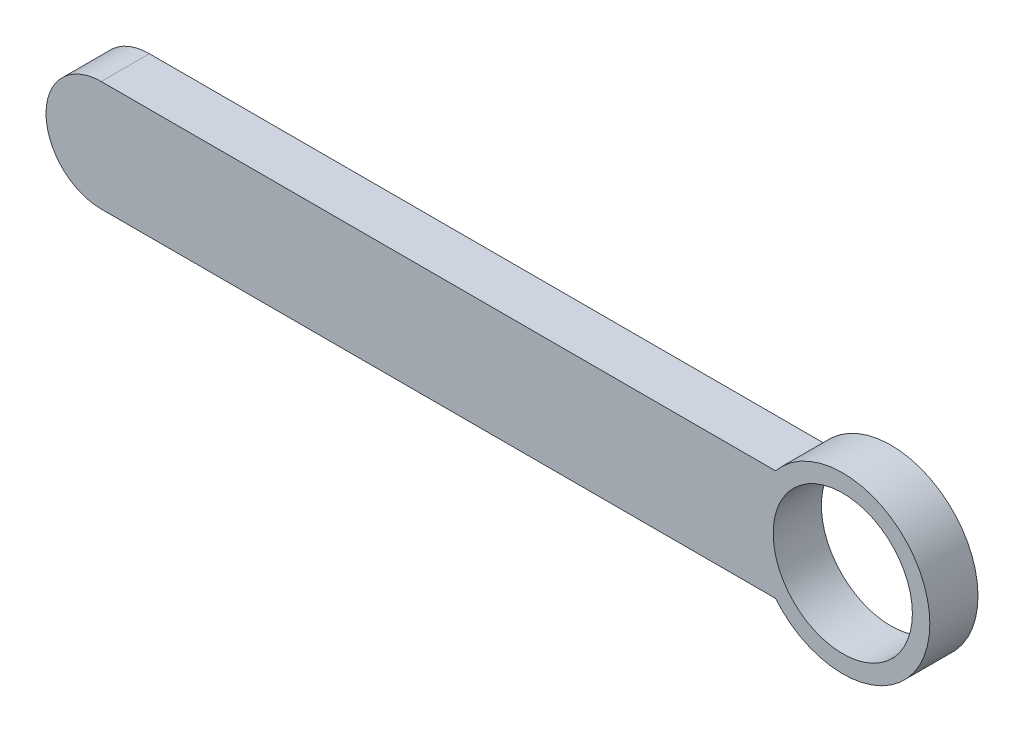
ISO-10303-21;
HEADER;
FILE_DESCRIPTION(('STEP AP214'),'2;1');
FILE_NAME('part.step','',(''),(''),'','','');
FILE_SCHEMA(('AUTOMOTIVE_DESIGN { 1 0 10303 214 1 1 1 1 }'));
ENDSEC;
DATA;
#1=APPLICATION_CONTEXT('core data for automotive mechanical design processes');
#2=APPLICATION_PROTOCOL_DEFINITION('international standard','automotive_design',2000,#1);
#3=PRODUCT_CONTEXT('',#1,'mechanical');
#4=PRODUCT('Part','Part','',(#3));
#5=PRODUCT_RELATED_PRODUCT_CATEGORY('part','',(#4));
#6=PRODUCT_DEFINITION_FORMATION('','',#4);
#7=PRODUCT_DEFINITION_CONTEXT('part definition',#1,'design');
#8=PRODUCT_DEFINITION('design','',#6,#7);
#9=PRODUCT_DEFINITION_SHAPE('','',#8);
#10=(LENGTH_UNIT() NAMED_UNIT(*) SI_UNIT(.MILLI.,.METRE.));
#11=(NAMED_UNIT(*) PLANE_ANGLE_UNIT() SI_UNIT($,.RADIAN.));
#12=(NAMED_UNIT(*) SI_UNIT($,.STERADIAN.) SOLID_ANGLE_UNIT());
#13=UNCERTAINTY_MEASURE_WITH_UNIT(LENGTH_MEASURE(1.E-05),#10,'distance_accuracy_value','');
#14=(GEOMETRIC_REPRESENTATION_CONTEXT(3) GLOBAL_UNCERTAINTY_ASSIGNED_CONTEXT((#13)) GLOBAL_UNIT_ASSIGNED_CONTEXT((#10,
#11,#12)) REPRESENTATION_CONTEXT('',''));
#15=CARTESIAN_POINT('',(0.,0.,0.));
#16=DIRECTION('',(0.,0.,1.));
#17=DIRECTION('',(1.,0.,0.));
#18=AXIS2_PLACEMENT_3D('',#15,#16,#17);
#19=CARTESIAN_POINT('',(0.,0.,2.7686));
#20=DIRECTION('',(0.,0.,1.));
#21=DIRECTION('',(1.,0.,0.));
#22=AXIS2_PLACEMENT_3D('',#19,#20,#21);
#23=PLANE('',#22);
#24=CARTESIAN_POINT('',(0.,0.,2.7686));
#25=DIRECTION('',(0.,0.,1.));
#26=DIRECTION('',(1.,0.,0.));
#27=AXIS2_PLACEMENT_3D('',#24,#25,#26);
#28=CIRCLE('',#27,5.0038);
#29=CARTESIAN_POINT('',(-3.86747843432901,-3.175,2.7686));
#30=VERTEX_POINT('',#29);
#31=CARTESIAN_POINT('',(-3.86747843432901,3.175,2.7686));
#32=VERTEX_POINT('',#31);
#33=EDGE_CURVE('E89',#30,#32,#28,.T.);
#34=ORIENTED_EDGE('',*,*,#33,.T.);
#35=DIRECTION('',(-1.,0.,0.));
#36=VECTOR('',#35,1.);
#37=CARTESIAN_POINT('',(-3.86747843432901,3.175,2.7686));
#38=LINE('',#37,#36);
#39=CARTESIAN_POINT('',(-42.6212,3.175,2.7686));
#40=VERTEX_POINT('',#39);
#41=EDGE_CURVE('E84',#32,#40,#38,.T.);
#42=ORIENTED_EDGE('',*,*,#41,.T.);
#43=CARTESIAN_POINT('',(-42.6212,0.,2.7686));
#44=DIRECTION('',(0.,0.,1.));
#45=DIRECTION('',(-1.,0.,0.));
#46=AXIS2_PLACEMENT_3D('',#43,#44,#45);
#47=CIRCLE('',#46,3.175);
#48=CARTESIAN_POINT('',(-42.6212,-3.175,2.7686));
#49=VERTEX_POINT('',#48);
#50=EDGE_CURVE('E87',#40,#49,#47,.T.);
#51=ORIENTED_EDGE('',*,*,#50,.T.);
#52=DIRECTION('',(1.,0.,0.));
#53=VECTOR('',#52,1.);
#54=CARTESIAN_POINT('',(-3.86747843432901,-3.175,2.7686));
#55=LINE('',#54,#53);
#56=EDGE_CURVE('E54',#49,#30,#55,.T.);
#57=ORIENTED_EDGE('',*,*,#56,.T.);
#58=EDGE_LOOP('',(#34,#42,#51,#57));
#59=FACE_BOUND('',#58,.T.);
#60=CARTESIAN_POINT('',(0.,0.,2.7686));
#61=DIRECTION('',(0.,0.,1.));
#62=DIRECTION('',(1.,0.,0.));
#63=AXIS2_PLACEMENT_3D('',#60,#61,#62);
#64=CIRCLE('',#63,4.0005);
#65=CARTESIAN_POINT('',(4.0005,0.,2.7686));
#66=VERTEX_POINT('',#65);
#67=EDGE_CURVE('E104',#66,#66,#64,.T.);
#68=ORIENTED_EDGE('',*,*,#67,.F.);
#69=EDGE_LOOP('',(#68));
#70=FACE_BOUND('',#69,.T.);
#71=ADVANCED_FACE('F37',(#59,#70),#23,.T.);
#72=CARTESIAN_POINT('',(0.,0.,0.));
#73=DIRECTION('',(0.,0.,1.));
#74=DIRECTION('',(1.,0.,0.));
#75=AXIS2_PLACEMENT_3D('',#72,#73,#74);
#76=PLANE('',#75);
#77=CARTESIAN_POINT('',(0.,0.,0.));
#78=DIRECTION('',(0.,0.,1.));
#79=DIRECTION('',(1.,0.,0.));
#80=AXIS2_PLACEMENT_3D('',#77,#78,#79);
#81=CIRCLE('',#80,5.0038);
#82=CARTESIAN_POINT('',(-3.86747843432901,-3.175,0.));
#83=VERTEX_POINT('',#82);
#84=CARTESIAN_POINT('',(-3.86747843432901,3.175,0.));
#85=VERTEX_POINT('',#84);
#86=EDGE_CURVE('E101',#83,#85,#81,.T.);
#87=ORIENTED_EDGE('',*,*,#86,.F.);
#88=DIRECTION('',(1.,0.,0.));
#89=VECTOR('',#88,1.);
#90=CARTESIAN_POINT('',(-3.86747843432901,-3.175,0.));
#91=LINE('',#90,#89);
#92=CARTESIAN_POINT('',(-42.6212,-3.175,0.));
#93=VERTEX_POINT('',#92);
#94=EDGE_CURVE('E77',#93,#83,#91,.T.);
#95=ORIENTED_EDGE('',*,*,#94,.F.);
#96=CARTESIAN_POINT('',(-42.6212,0.,0.));
#97=DIRECTION('',(0.,0.,1.));
#98=DIRECTION('',(-1.,0.,0.));
#99=AXIS2_PLACEMENT_3D('',#96,#97,#98);
#100=CIRCLE('',#99,3.175);
#101=CARTESIAN_POINT('',(-42.6212,3.175,0.));
#102=VERTEX_POINT('',#101);
#103=EDGE_CURVE('E71',#102,#93,#100,.T.);
#104=ORIENTED_EDGE('',*,*,#103,.F.);
#105=DIRECTION('',(-1.,0.,0.));
#106=VECTOR('',#105,1.);
#107=CARTESIAN_POINT('',(-3.86747843432901,3.175,0.));
#108=LINE('',#107,#106);
#109=EDGE_CURVE('E93',#85,#102,#108,.T.);
#110=ORIENTED_EDGE('',*,*,#109,.F.);
#111=EDGE_LOOP('',(#87,#95,#104,#110));
#112=FACE_BOUND('',#111,.T.);
#113=CARTESIAN_POINT('',(0.,0.,0.));
#114=DIRECTION('',(0.,0.,1.));
#115=DIRECTION('',(1.,0.,0.));
#116=AXIS2_PLACEMENT_3D('',#113,#114,#115);
#117=CIRCLE('',#116,4.0005);
#118=CARTESIAN_POINT('',(4.0005,0.,0.));
#119=VERTEX_POINT('',#118);
#120=EDGE_CURVE('E116',#119,#119,#117,.T.);
#121=ORIENTED_EDGE('',*,*,#120,.T.);
#122=EDGE_LOOP('',(#121));
#123=FACE_BOUND('',#122,.T.);
#124=ADVANCED_FACE('F112',(#112,#123),#76,.F.);
#125=CARTESIAN_POINT('',(0.,0.,2.7686));
#126=DIRECTION('',(0.,0.,-1.));
#127=DIRECTION('',(-1.,0.,0.));
#128=AXIS2_PLACEMENT_3D('',#125,#126,#127);
#129=CYLINDRICAL_SURFACE('',#128,5.0038);
#130=ORIENTED_EDGE('',*,*,#86,.T.);
#131=DIRECTION('',(0.,0.,-1.));
#132=VECTOR('',#131,1.);
#133=CARTESIAN_POINT('',(-3.86747843432901,3.175,2.7686));
#134=LINE('',#133,#132);
#135=EDGE_CURVE('E11',#32,#85,#134,.T.);
#136=ORIENTED_EDGE('',*,*,#135,.F.);
#137=ORIENTED_EDGE('',*,*,#33,.F.);
#138=DIRECTION('',(0.,0.,-1.));
#139=VECTOR('',#138,1.);
#140=CARTESIAN_POINT('',(-3.86747843432901,-3.175,2.7686));
#141=LINE('',#140,#139);
#142=EDGE_CURVE('E97',#30,#83,#141,.T.);
#143=ORIENTED_EDGE('',*,*,#142,.T.);
#144=EDGE_LOOP('',(#130,#136,#137,#143));
#145=FACE_BOUND('',#144,.T.);
#146=ADVANCED_FACE('F39',(#145),#129,.T.);
#147=CARTESIAN_POINT('',(-3.86747843432901,3.175,2.7686));
#148=DIRECTION('',(0.,-1.,0.));
#149=DIRECTION('',(1.,0.,0.));
#150=AXIS2_PLACEMENT_3D('',#147,#148,#149);
#151=PLANE('',#150);
#152=ORIENTED_EDGE('',*,*,#109,.T.);
#153=DIRECTION('',(0.,0.,-1.));
#154=VECTOR('',#153,1.);
#155=CARTESIAN_POINT('',(-42.6212,3.175,2.7686));
#156=LINE('',#155,#154);
#157=EDGE_CURVE('E46',#40,#102,#156,.T.);
#158=ORIENTED_EDGE('',*,*,#157,.F.);
#159=ORIENTED_EDGE('',*,*,#41,.F.);
#160=ORIENTED_EDGE('',*,*,#135,.T.);
#161=EDGE_LOOP('',(#152,#158,#159,#160));
#162=FACE_BOUND('',#161,.T.);
#163=ADVANCED_FACE('F92',(#162),#151,.F.);
#164=CARTESIAN_POINT('',(-42.6212,0.,2.7686));
#165=DIRECTION('',(0.,0.,-1.));
#166=DIRECTION('',(-1.,0.,0.));
#167=AXIS2_PLACEMENT_3D('',#164,#165,#166);
#168=CYLINDRICAL_SURFACE('',#167,3.175);
#169=ORIENTED_EDGE('',*,*,#103,.T.);
#170=DIRECTION('',(0.,0.,-1.));
#171=VECTOR('',#170,1.);
#172=CARTESIAN_POINT('',(-42.6212,-3.175,2.7686));
#173=LINE('',#172,#171);
#174=EDGE_CURVE('E94',#49,#93,#173,.T.);
#175=ORIENTED_EDGE('',*,*,#174,.F.);
#176=ORIENTED_EDGE('',*,*,#50,.F.);
#177=ORIENTED_EDGE('',*,*,#157,.T.);
#178=EDGE_LOOP('',(#169,#175,#176,#177));
#179=FACE_BOUND('',#178,.T.);
#180=ADVANCED_FACE('F95',(#179),#168,.T.);
#181=CARTESIAN_POINT('',(-3.86747843432901,-3.175,2.7686));
#182=DIRECTION('',(0.,1.,0.));
#183=DIRECTION('',(-1.,0.,0.));
#184=AXIS2_PLACEMENT_3D('',#181,#182,#183);
#185=PLANE('',#184);
#186=ORIENTED_EDGE('',*,*,#94,.T.);
#187=ORIENTED_EDGE('',*,*,#142,.F.);
#188=ORIENTED_EDGE('',*,*,#56,.F.);
#189=ORIENTED_EDGE('',*,*,#174,.T.);
#190=EDGE_LOOP('',(#186,#187,#188,#189));
#191=FACE_BOUND('',#190,.T.);
#192=ADVANCED_FACE('F109',(#191),#185,.F.);
#193=CARTESIAN_POINT('',(0.,0.,2.7686));
#194=DIRECTION('',(0.,0.,-1.));
#195=DIRECTION('',(-1.,0.,0.));
#196=AXIS2_PLACEMENT_3D('',#193,#194,#195);
#197=CYLINDRICAL_SURFACE('',#196,4.0005);
#198=ORIENTED_EDGE('',*,*,#67,.T.);
#199=EDGE_LOOP('',(#198));
#200=FACE_BOUND('',#199,.T.);
#201=ORIENTED_EDGE('',*,*,#120,.F.);
#202=EDGE_LOOP('',(#201));
#203=FACE_BOUND('',#202,.T.);
#204=ADVANCED_FACE('F122',(#200,#203),#197,.F.);
#205=CLOSED_SHELL('',(#71,#124,#146,#163,#180,#192,#204));
#206=MANIFOLD_SOLID_BREP('B2',#205);
#207=ADVANCED_BREP_SHAPE_REPRESENTATION('',(#18,#206),#14);
#208=SHAPE_DEFINITION_REPRESENTATION(#9,#207);
ENDSEC;
END-ISO-10303-21;
